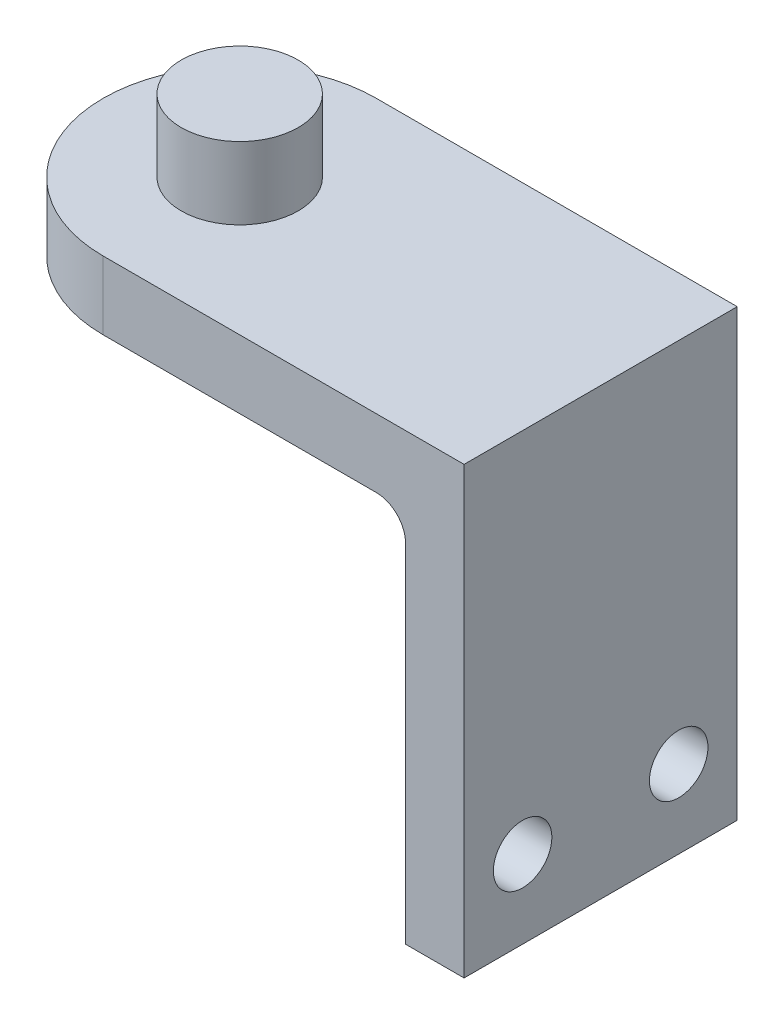
ISO-10303-21;
HEADER;
FILE_DESCRIPTION(('STEP AP214'),'2;1');
FILE_NAME('part.step','',(''),(''),'','','');
FILE_SCHEMA(('AUTOMOTIVE_DESIGN { 1 0 10303 214 1 1 1 1 }'));
ENDSEC;
DATA;
#1=APPLICATION_CONTEXT('core data for automotive mechanical design processes');
#2=APPLICATION_PROTOCOL_DEFINITION('international standard','automotive_design',2000,#1);
#3=PRODUCT_CONTEXT('',#1,'mechanical');
#4=PRODUCT('Part','Part','',(#3));
#5=PRODUCT_RELATED_PRODUCT_CATEGORY('part','',(#4));
#6=PRODUCT_DEFINITION_FORMATION('','',#4);
#7=PRODUCT_DEFINITION_CONTEXT('part definition',#1,'design');
#8=PRODUCT_DEFINITION('design','',#6,#7);
#9=PRODUCT_DEFINITION_SHAPE('','',#8);
#10=(LENGTH_UNIT() NAMED_UNIT(*) SI_UNIT(.MILLI.,.METRE.));
#11=(NAMED_UNIT(*) PLANE_ANGLE_UNIT() SI_UNIT($,.RADIAN.));
#12=(NAMED_UNIT(*) SI_UNIT($,.STERADIAN.) SOLID_ANGLE_UNIT());
#13=UNCERTAINTY_MEASURE_WITH_UNIT(LENGTH_MEASURE(1.E-05),#10,'distance_accuracy_value','');
#14=(GEOMETRIC_REPRESENTATION_CONTEXT(3) GLOBAL_UNCERTAINTY_ASSIGNED_CONTEXT((#13)) GLOBAL_UNIT_ASSIGNED_CONTEXT((#10,
#11,#12)) REPRESENTATION_CONTEXT('',''));
#15=CARTESIAN_POINT('',(0.,0.,0.));
#16=DIRECTION('',(0.,0.,1.));
#17=DIRECTION('',(1.,0.,0.));
#18=AXIS2_PLACEMENT_3D('',#15,#16,#17);
#19=CARTESIAN_POINT('',(21.,0.,7.));
#20=DIRECTION('',(0.,1.,0.));
#21=DIRECTION('',(0.,0.,1.));
#22=AXIS2_PLACEMENT_3D('',#19,#20,#21);
#23=PLANE('',#22);
#24=DIRECTION('',(1.,0.,0.));
#25=VECTOR('',#24,1.);
#26=CARTESIAN_POINT('',(21.,0.,-7.));
#27=LINE('',#26,#25);
#28=CARTESIAN_POINT('',(21.,0.,-7.));
#29=VERTEX_POINT('',#28);
#30=CARTESIAN_POINT('',(24.,0.,-7.));
#31=VERTEX_POINT('',#30);
#32=EDGE_CURVE('E213',#29,#31,#27,.T.);
#33=ORIENTED_EDGE('',*,*,#32,.T.);
#34=DIRECTION('',(0.,0.,-1.));
#35=VECTOR('',#34,1.);
#36=CARTESIAN_POINT('',(24.,0.,7.));
#37=LINE('',#36,#35);
#38=CARTESIAN_POINT('',(24.,0.,7.));
#39=VERTEX_POINT('',#38);
#40=EDGE_CURVE('E216',#39,#31,#37,.T.);
#41=ORIENTED_EDGE('',*,*,#40,.F.);
#42=DIRECTION('',(1.,0.,0.));
#43=VECTOR('',#42,1.);
#44=CARTESIAN_POINT('',(21.,0.,7.));
#45=LINE('',#44,#43);
#46=CARTESIAN_POINT('',(21.,0.,7.));
#47=VERTEX_POINT('',#46);
#48=EDGE_CURVE('E212',#47,#39,#45,.T.);
#49=ORIENTED_EDGE('',*,*,#48,.F.);
#50=DIRECTION('',(0.,0.,-1.));
#51=VECTOR('',#50,1.);
#52=CARTESIAN_POINT('',(21.,0.,7.));
#53=LINE('',#52,#51);
#54=EDGE_CURVE('E222',#47,#29,#53,.T.);
#55=ORIENTED_EDGE('',*,*,#54,.T.);
#56=EDGE_LOOP('',(#33,#41,#49,#55));
#57=FACE_BOUND('',#56,.T.);
#58=DIRECTION('',(0.,0.,1.));
#59=VECTOR('',#58,1.);
#60=CARTESIAN_POINT('',(21.9,0.,6.7));
#61=LINE('',#60,#59);
#62=CARTESIAN_POINT('',(21.9,0.,-6.7));
#63=VERTEX_POINT('',#62);
#64=CARTESIAN_POINT('',(21.9,0.,6.7));
#65=VERTEX_POINT('',#64);
#66=EDGE_CURVE('E537',#63,#65,#61,.T.);
#67=ORIENTED_EDGE('',*,*,#66,.T.);
#68=DIRECTION('',(1.,0.,0.));
#69=VECTOR('',#68,1.);
#70=CARTESIAN_POINT('',(21.9,0.,6.7));
#71=LINE('',#70,#69);
#72=CARTESIAN_POINT('',(23.1,0.,6.7));
#73=VERTEX_POINT('',#72);
#74=EDGE_CURVE('E171',#65,#73,#71,.T.);
#75=ORIENTED_EDGE('',*,*,#74,.T.);
#76=DIRECTION('',(0.,0.,-1.));
#77=VECTOR('',#76,1.);
#78=CARTESIAN_POINT('',(23.1,0.,6.7));
#79=LINE('',#78,#77);
#80=CARTESIAN_POINT('',(23.1,0.,-6.7));
#81=VERTEX_POINT('',#80);
#82=EDGE_CURVE('E532',#73,#81,#79,.T.);
#83=ORIENTED_EDGE('',*,*,#82,.T.);
#84=DIRECTION('',(-1.,0.,0.));
#85=VECTOR('',#84,1.);
#86=CARTESIAN_POINT('',(21.9,0.,-6.7));
#87=LINE('',#86,#85);
#88=EDGE_CURVE('E167',#81,#63,#87,.T.);
#89=ORIENTED_EDGE('',*,*,#88,.T.);
#90=EDGE_LOOP('',(#67,#75,#83,#89));
#91=FACE_BOUND('',#90,.T.);
#92=ADVANCED_FACE('F37',(#57,#91),#23,.F.);
#93=CARTESIAN_POINT('',(5.5,19.3,0.));
#94=DIRECTION('',(0.,1.,0.));
#95=DIRECTION('',(0.,0.,1.));
#96=AXIS2_PLACEMENT_3D('',#93,#94,#95);
#97=PLANE('',#96);
#98=DIRECTION('',(-1.,0.,0.));
#99=VECTOR('',#98,1.);
#100=CARTESIAN_POINT('',(24.,19.3,-7.));
#101=LINE('',#100,#99);
#102=CARTESIAN_POINT('',(19.5,19.3,-7.));
#103=VERTEX_POINT('',#102);
#104=CARTESIAN_POINT('',(5.5,19.3,-7.));
#105=VERTEX_POINT('',#104);
#106=EDGE_CURVE('E230',#103,#105,#101,.T.);
#107=ORIENTED_EDGE('',*,*,#106,.F.);
#108=DIRECTION('',(0.,0.,-1.));
#109=VECTOR('',#108,1.);
#110=CARTESIAN_POINT('',(19.5,19.3,7.));
#111=LINE('',#110,#109);
#112=CARTESIAN_POINT('',(19.5,19.3,-2.7));
#113=VERTEX_POINT('',#112);
#114=EDGE_CURVE('E257',#103,#113,#111,.F.);
#115=ORIENTED_EDGE('',*,*,#114,.T.);
#116=DIRECTION('',(-1.,0.,0.));
#117=VECTOR('',#116,1.);
#118=CARTESIAN_POINT('',(20.7,19.3,-2.7));
#119=LINE('',#118,#117);
#120=CARTESIAN_POINT('',(8.0298221281347,19.3,-2.7));
#121=VERTEX_POINT('',#120);
#122=EDGE_CURVE('E176',#113,#121,#119,.T.);
#123=ORIENTED_EDGE('',*,*,#122,.T.);
#124=CARTESIAN_POINT('',(5.5,19.3,0.));
#125=DIRECTION('',(0.,1.,0.));
#126=DIRECTION('',(0.,0.,1.));
#127=AXIS2_PLACEMENT_3D('',#124,#125,#126);
#128=CIRCLE('',#127,3.7);
#129=CARTESIAN_POINT('',(8.0298221281347,19.3,2.7));
#130=VERTEX_POINT('',#129);
#131=EDGE_CURVE('E197',#121,#130,#128,.T.);
#132=ORIENTED_EDGE('',*,*,#131,.T.);
#133=DIRECTION('',(1.,0.,0.));
#134=VECTOR('',#133,1.);
#135=CARTESIAN_POINT('',(5.5,19.3,2.7));
#136=LINE('',#135,#134);
#137=CARTESIAN_POINT('',(19.5,19.3,2.7));
#138=VERTEX_POINT('',#137);
#139=EDGE_CURVE('E172',#130,#138,#136,.T.);
#140=ORIENTED_EDGE('',*,*,#139,.T.);
#141=DIRECTION('',(0.,0.,-1.));
#142=VECTOR('',#141,1.);
#143=CARTESIAN_POINT('',(19.5,19.3,7.));
#144=LINE('',#143,#142);
#145=CARTESIAN_POINT('',(19.5,19.3,7.));
#146=VERTEX_POINT('',#145);
#147=EDGE_CURVE('E255',#138,#146,#144,.F.);
#148=ORIENTED_EDGE('',*,*,#147,.T.);
#149=DIRECTION('',(1.,0.,0.));
#150=VECTOR('',#149,1.);
#151=CARTESIAN_POINT('',(5.5,19.3,7.));
#152=LINE('',#151,#150);
#153=CARTESIAN_POINT('',(5.5,19.3,7.));
#154=VERTEX_POINT('',#153);
#155=EDGE_CURVE('E239',#154,#146,#152,.T.);
#156=ORIENTED_EDGE('',*,*,#155,.F.);
#157=CARTESIAN_POINT('',(5.5,19.3,0.));
#158=DIRECTION('',(0.,1.,0.));
#159=DIRECTION('',(0.,0.,1.));
#160=AXIS2_PLACEMENT_3D('',#157,#158,#159);
#161=CIRCLE('',#160,7.);
#162=EDGE_CURVE('E225',#105,#154,#161,.T.);
#163=ORIENTED_EDGE('',*,*,#162,.F.);
#164=EDGE_LOOP('',(#107,#115,#123,#132,#140,#148,#156,#163));
#165=FACE_BOUND('',#164,.T.);
#166=ADVANCED_FACE('F272',(#165),#97,.F.);
#167=CARTESIAN_POINT('',(5.5,20.9,0.));
#168=DIRECTION('',(0.,-1.,0.));
#169=DIRECTION('',(0.,0.,-1.));
#170=AXIS2_PLACEMENT_3D('',#167,#168,#169);
#171=CYLINDRICAL_SURFACE('',#170,3.7);
#172=CARTESIAN_POINT('',(5.5,20.9,0.));
#173=DIRECTION('',(0.,1.,0.));
#174=DIRECTION('',(0.,0.,1.));
#175=AXIS2_PLACEMENT_3D('',#172,#173,#174);
#176=CIRCLE('',#175,3.7);
#177=CARTESIAN_POINT('',(8.02982212813471,20.9,-2.7));
#178=VERTEX_POINT('',#177);
#179=CARTESIAN_POINT('',(8.0298221281347,20.9,2.7));
#180=VERTEX_POINT('',#179);
#181=EDGE_CURVE('E198',#178,#180,#176,.T.);
#182=ORIENTED_EDGE('',*,*,#181,.T.);
#183=DIRECTION('',(0.,-1.,0.));
#184=VECTOR('',#183,1.);
#185=CARTESIAN_POINT('',(8.02982212813471,20.9,2.7));
#186=LINE('',#185,#184);
#187=EDGE_CURVE('E194',#180,#130,#186,.T.);
#188=ORIENTED_EDGE('',*,*,#187,.T.);
#189=ORIENTED_EDGE('',*,*,#131,.F.);
#190=DIRECTION('',(0.,-1.,0.));
#191=VECTOR('',#190,1.);
#192=CARTESIAN_POINT('',(8.02982212813471,20.9,-2.7));
#193=LINE('',#192,#191);
#194=EDGE_CURVE('E191',#121,#178,#193,.F.);
#195=ORIENTED_EDGE('',*,*,#194,.T.);
#196=EDGE_LOOP('',(#182,#188,#189,#195));
#197=FACE_BOUND('',#196,.T.);
#198=ADVANCED_FACE('F312',(#197),#171,.F.);
#199=CARTESIAN_POINT('',(5.5,22.8,0.));
#200=DIRECTION('',(0.,-1.,0.));
#201=DIRECTION('',(0.,0.,-1.));
#202=AXIS2_PLACEMENT_3D('',#199,#200,#201);
#203=CYLINDRICAL_SURFACE('',#202,7.);
#204=ORIENTED_EDGE('',*,*,#162,.T.);
#205=DIRECTION('',(0.,-1.,0.));
#206=VECTOR('',#205,1.);
#207=CARTESIAN_POINT('',(5.5,22.8,7.));
#208=LINE('',#207,#206);
#209=CARTESIAN_POINT('',(5.5,22.8,7.));
#210=VERTEX_POINT('',#209);
#211=EDGE_CURVE('E249',#210,#154,#208,.T.);
#212=ORIENTED_EDGE('',*,*,#211,.F.);
#213=CARTESIAN_POINT('',(5.5,22.8,0.));
#214=DIRECTION('',(0.,1.,0.));
#215=DIRECTION('',(0.,0.,1.));
#216=AXIS2_PLACEMENT_3D('',#213,#214,#215);
#217=CIRCLE('',#216,7.);
#218=CARTESIAN_POINT('',(5.5,22.8,-7.));
#219=VERTEX_POINT('',#218);
#220=EDGE_CURVE('E226',#219,#210,#217,.T.);
#221=ORIENTED_EDGE('',*,*,#220,.F.);
#222=DIRECTION('',(0.,-1.,0.));
#223=VECTOR('',#222,1.);
#224=CARTESIAN_POINT('',(5.5,22.8,-7.));
#225=LINE('',#224,#223);
#226=EDGE_CURVE('E236',#219,#105,#225,.T.);
#227=ORIENTED_EDGE('',*,*,#226,.T.);
#228=EDGE_LOOP('',(#204,#212,#221,#227));
#229=FACE_BOUND('',#228,.T.);
#230=ADVANCED_FACE('F301',(#229),#203,.T.);
#231=CARTESIAN_POINT('',(5.5,22.8,7.));
#232=DIRECTION('',(0.,0.,-1.));
#233=DIRECTION('',(-1.,0.,0.));
#234=AXIS2_PLACEMENT_3D('',#231,#232,#233);
#235=PLANE('',#234);
#236=DIRECTION('',(0.,-1.,0.));
#237=VECTOR('',#236,1.);
#238=CARTESIAN_POINT('',(24.,22.8,7.));
#239=LINE('',#238,#237);
#240=CARTESIAN_POINT('',(24.,22.8,7.));
#241=VERTEX_POINT('',#240);
#242=EDGE_CURVE('E247',#241,#39,#239,.T.);
#243=ORIENTED_EDGE('',*,*,#242,.F.);
#244=DIRECTION('',(1.,0.,0.));
#245=VECTOR('',#244,1.);
#246=CARTESIAN_POINT('',(5.5,22.8,7.));
#247=LINE('',#246,#245);
#248=EDGE_CURVE('E229',#210,#241,#247,.T.);
#249=ORIENTED_EDGE('',*,*,#248,.F.);
#250=ORIENTED_EDGE('',*,*,#211,.T.);
#251=ORIENTED_EDGE('',*,*,#155,.T.);
#252=CARTESIAN_POINT('',(19.5,17.8,7.));
#253=DIRECTION('',(0.,0.,-1.));
#254=DIRECTION('',(-1.,0.,0.));
#255=AXIS2_PLACEMENT_3D('',#252,#253,#254);
#256=CIRCLE('',#255,1.5);
#257=CARTESIAN_POINT('',(21.,17.8,7.));
#258=VERTEX_POINT('',#257);
#259=EDGE_CURVE('E11',#146,#258,#256,.T.);
#260=ORIENTED_EDGE('',*,*,#259,.T.);
#261=DIRECTION('',(0.,-1.,0.));
#262=VECTOR('',#261,1.);
#263=CARTESIAN_POINT('',(21.,0.,7.));
#264=LINE('',#263,#262);
#265=EDGE_CURVE('E210',#258,#47,#264,.T.);
#266=ORIENTED_EDGE('',*,*,#265,.T.);
#267=ORIENTED_EDGE('',*,*,#48,.T.);
#268=EDGE_LOOP('',(#243,#249,#250,#251,#260,#266,#267));
#269=FACE_BOUND('',#268,.T.);
#270=ADVANCED_FACE('F280',(#269),#235,.F.);
#271=CARTESIAN_POINT('',(24.,22.8,7.));
#272=DIRECTION('',(-1.,0.,0.));
#273=DIRECTION('',(0.,0.,1.));
#274=AXIS2_PLACEMENT_3D('',#271,#272,#273);
#275=PLANE('',#274);
#276=CARTESIAN_POINT('',(24.,4.,4.));
#277=DIRECTION('',(1.,0.,0.));
#278=DIRECTION('',(0.,0.,-1.));
#279=AXIS2_PLACEMENT_3D('',#276,#277,#278);
#280=CIRCLE('',#279,1.5);
#281=CARTESIAN_POINT('',(24.,4.,2.5));
#282=VERTEX_POINT('',#281);
#283=EDGE_CURVE('E553',#282,#282,#280,.T.);
#284=ORIENTED_EDGE('',*,*,#283,.F.);
#285=EDGE_LOOP('',(#284));
#286=FACE_BOUND('',#285,.T.);
#287=CARTESIAN_POINT('',(24.,4.,-4.));
#288=DIRECTION('',(1.,0.,0.));
#289=DIRECTION('',(0.,0.,-1.));
#290=AXIS2_PLACEMENT_3D('',#287,#288,#289);
#291=CIRCLE('',#290,1.5);
#292=CARTESIAN_POINT('',(24.,4.,-5.5));
#293=VERTEX_POINT('',#292);
#294=EDGE_CURVE('E547',#293,#293,#291,.T.);
#295=ORIENTED_EDGE('',*,*,#294,.F.);
#296=EDGE_LOOP('',(#295));
#297=FACE_BOUND('',#296,.T.);
#298=ORIENTED_EDGE('',*,*,#242,.T.);
#299=ORIENTED_EDGE('',*,*,#40,.T.);
#300=DIRECTION('',(0.,-1.,0.));
#301=VECTOR('',#300,1.);
#302=CARTESIAN_POINT('',(24.,22.8,-7.));
#303=LINE('',#302,#301);
#304=CARTESIAN_POINT('',(24.,22.8,-7.));
#305=VERTEX_POINT('',#304);
#306=EDGE_CURVE('E245',#305,#31,#303,.T.);
#307=ORIENTED_EDGE('',*,*,#306,.F.);
#308=DIRECTION('',(0.,0.,-1.));
#309=VECTOR('',#308,1.);
#310=CARTESIAN_POINT('',(24.,22.8,7.));
#311=LINE('',#310,#309);
#312=EDGE_CURVE('E232',#241,#305,#311,.T.);
#313=ORIENTED_EDGE('',*,*,#312,.F.);
#314=EDGE_LOOP('',(#298,#299,#307,#313));
#315=FACE_BOUND('',#314,.T.);
#316=ADVANCED_FACE('F293',(#286,#297,#315),#275,.F.);
#317=CARTESIAN_POINT('',(24.,22.8,-7.));
#318=DIRECTION('',(0.,0.,1.));
#319=DIRECTION('',(1.,0.,0.));
#320=AXIS2_PLACEMENT_3D('',#317,#318,#319);
#321=PLANE('',#320);
#322=ORIENTED_EDGE('',*,*,#306,.T.);
#323=ORIENTED_EDGE('',*,*,#32,.F.);
#324=DIRECTION('',(0.,-1.,0.));
#325=VECTOR('',#324,1.);
#326=CARTESIAN_POINT('',(21.,0.,-7.));
#327=LINE('',#326,#325);
#328=CARTESIAN_POINT('',(21.,17.8,-7.));
#329=VERTEX_POINT('',#328);
#330=EDGE_CURVE('E207',#329,#29,#327,.T.);
#331=ORIENTED_EDGE('',*,*,#330,.F.);
#332=CARTESIAN_POINT('',(19.5,17.8,-7.));
#333=DIRECTION('',(0.,0.,1.));
#334=DIRECTION('',(1.,0.,0.));
#335=AXIS2_PLACEMENT_3D('',#332,#333,#334);
#336=CIRCLE('',#335,1.5);
#337=EDGE_CURVE('E259',#329,#103,#336,.T.);
#338=ORIENTED_EDGE('',*,*,#337,.T.);
#339=ORIENTED_EDGE('',*,*,#106,.T.);
#340=ORIENTED_EDGE('',*,*,#226,.F.);
#341=DIRECTION('',(-1.,0.,0.));
#342=VECTOR('',#341,1.);
#343=CARTESIAN_POINT('',(24.,22.8,-7.));
#344=LINE('',#343,#342);
#345=EDGE_CURVE('E234',#305,#219,#344,.T.);
#346=ORIENTED_EDGE('',*,*,#345,.F.);
#347=EDGE_LOOP('',(#322,#323,#331,#338,#339,#340,#346));
#348=FACE_BOUND('',#347,.T.);
#349=ADVANCED_FACE('F341',(#348),#321,.F.);
#350=CARTESIAN_POINT('',(5.5,22.8,0.));
#351=DIRECTION('',(0.,1.,0.));
#352=DIRECTION('',(0.,0.,1.));
#353=AXIS2_PLACEMENT_3D('',#350,#351,#352);
#354=PLANE('',#353);
#355=CARTESIAN_POINT('',(5.5,22.8,0.));
#356=DIRECTION('',(0.,1.,0.));
#357=DIRECTION('',(0.,0.,1.));
#358=AXIS2_PLACEMENT_3D('',#355,#356,#357);
#359=CIRCLE('',#358,3.);
#360=CARTESIAN_POINT('',(5.5,22.8,3.));
#361=VERTEX_POINT('',#360);
#362=EDGE_CURVE('E201',#361,#361,#359,.T.);
#363=ORIENTED_EDGE('',*,*,#362,.F.);
#364=EDGE_LOOP('',(#363));
#365=FACE_BOUND('',#364,.T.);
#366=ORIENTED_EDGE('',*,*,#345,.T.);
#367=ORIENTED_EDGE('',*,*,#220,.T.);
#368=ORIENTED_EDGE('',*,*,#248,.T.);
#369=ORIENTED_EDGE('',*,*,#312,.T.);
#370=EDGE_LOOP('',(#366,#367,#368,#369));
#371=FACE_BOUND('',#370,.T.);
#372=ADVANCED_FACE('F296',(#365,#371),#354,.T.);
#373=CARTESIAN_POINT('',(21.,0.,7.));
#374=DIRECTION('',(1.,0.,0.));
#375=DIRECTION('',(0.,0.,-1.));
#376=AXIS2_PLACEMENT_3D('',#373,#374,#375);
#377=PLANE('',#376);
#378=CARTESIAN_POINT('',(21.,4.,4.));
#379=DIRECTION('',(1.,0.,0.));
#380=DIRECTION('',(0.,0.,-1.));
#381=AXIS2_PLACEMENT_3D('',#378,#379,#380);
#382=CIRCLE('',#381,1.5);
#383=CARTESIAN_POINT('',(21.,4.,2.5));
#384=VERTEX_POINT('',#383);
#385=EDGE_CURVE('E539',#384,#384,#382,.T.);
#386=ORIENTED_EDGE('',*,*,#385,.T.);
#387=EDGE_LOOP('',(#386));
#388=FACE_BOUND('',#387,.T.);
#389=CARTESIAN_POINT('',(21.,4.,-4.));
#390=DIRECTION('',(1.,0.,0.));
#391=DIRECTION('',(0.,0.,-1.));
#392=AXIS2_PLACEMENT_3D('',#389,#390,#391);
#393=CIRCLE('',#392,1.5);
#394=CARTESIAN_POINT('',(21.,4.,-5.5));
#395=VERTEX_POINT('',#394);
#396=EDGE_CURVE('E550',#395,#395,#393,.T.);
#397=ORIENTED_EDGE('',*,*,#396,.T.);
#398=EDGE_LOOP('',(#397));
#399=FACE_BOUND('',#398,.T.);
#400=ORIENTED_EDGE('',*,*,#265,.F.);
#401=DIRECTION('',(0.,0.,-1.));
#402=VECTOR('',#401,1.);
#403=CARTESIAN_POINT('',(21.,17.8,-7.));
#404=LINE('',#403,#402);
#405=EDGE_CURVE('E252',#258,#329,#404,.T.);
#406=ORIENTED_EDGE('',*,*,#405,.T.);
#407=ORIENTED_EDGE('',*,*,#330,.T.);
#408=ORIENTED_EDGE('',*,*,#54,.F.);
#409=EDGE_LOOP('',(#400,#406,#407,#408));
#410=FACE_BOUND('',#409,.T.);
#411=ADVANCED_FACE('F284',(#388,#399,#410),#377,.F.);
#412=CARTESIAN_POINT('',(5.5,26.5,0.));
#413=DIRECTION('',(0.,-1.,0.));
#414=DIRECTION('',(0.,0.,-1.));
#415=AXIS2_PLACEMENT_3D('',#412,#413,#414);
#416=CYLINDRICAL_SURFACE('',#415,3.);
#417=CARTESIAN_POINT('',(5.5,26.5,0.));
#418=DIRECTION('',(0.,1.,0.));
#419=DIRECTION('',(0.,0.,1.));
#420=AXIS2_PLACEMENT_3D('',#417,#418,#419);
#421=CIRCLE('',#420,3.);
#422=CARTESIAN_POINT('',(5.5,26.5,3.));
#423=VERTEX_POINT('',#422);
#424=EDGE_CURVE('E204',#423,#423,#421,.T.);
#425=ORIENTED_EDGE('',*,*,#424,.F.);
#426=EDGE_LOOP('',(#425));
#427=FACE_BOUND('',#426,.T.);
#428=ORIENTED_EDGE('',*,*,#362,.T.);
#429=EDGE_LOOP('',(#428));
#430=FACE_BOUND('',#429,.T.);
#431=ADVANCED_FACE('F325',(#427,#430),#416,.T.);
#432=CARTESIAN_POINT('',(5.5,26.5,0.));
#433=DIRECTION('',(0.,1.,0.));
#434=DIRECTION('',(0.,0.,1.));
#435=AXIS2_PLACEMENT_3D('',#432,#433,#434);
#436=PLANE('',#435);
#437=ORIENTED_EDGE('',*,*,#424,.T.);
#438=EDGE_LOOP('',(#437));
#439=FACE_BOUND('',#438,.T.);
#440=ADVANCED_FACE('F318',(#439),#436,.T.);
#441=CARTESIAN_POINT('',(5.5,20.9,0.));
#442=DIRECTION('',(0.,1.,0.));
#443=DIRECTION('',(0.,0.,1.));
#444=AXIS2_PLACEMENT_3D('',#441,#442,#443);
#445=PLANE('',#444);
#446=ORIENTED_EDGE('',*,*,#181,.F.);
#447=DIRECTION('',(-1.,0.,0.));
#448=VECTOR('',#447,1.);
#449=CARTESIAN_POINT('',(20.7,20.9,-2.7));
#450=LINE('',#449,#448);
#451=CARTESIAN_POINT('',(20.7,20.9,-2.7));
#452=VERTEX_POINT('',#451);
#453=EDGE_CURVE('E186',#452,#178,#450,.T.);
#454=ORIENTED_EDGE('',*,*,#453,.F.);
#455=DIRECTION('',(0.,0.,-1.));
#456=VECTOR('',#455,1.);
#457=CARTESIAN_POINT('',(20.7,20.9,2.7));
#458=LINE('',#457,#456);
#459=CARTESIAN_POINT('',(20.7,20.9,2.7));
#460=VERTEX_POINT('',#459);
#461=EDGE_CURVE('E184',#460,#452,#458,.T.);
#462=ORIENTED_EDGE('',*,*,#461,.F.);
#463=DIRECTION('',(1.,0.,0.));
#464=VECTOR('',#463,1.);
#465=CARTESIAN_POINT('',(5.5,20.9,2.7));
#466=LINE('',#465,#464);
#467=EDGE_CURVE('E182',#180,#460,#466,.T.);
#468=ORIENTED_EDGE('',*,*,#467,.F.);
#469=EDGE_LOOP('',(#446,#454,#462,#468));
#470=FACE_BOUND('',#469,.T.);
#471=ADVANCED_FACE('F316',(#470),#445,.F.);
#472=CARTESIAN_POINT('',(5.5,20.9,2.7));
#473=DIRECTION('',(0.,0.,-1.));
#474=DIRECTION('',(-1.,0.,0.));
#475=AXIS2_PLACEMENT_3D('',#472,#473,#474);
#476=PLANE('',#475);
#477=ORIENTED_EDGE('',*,*,#467,.T.);
#478=DIRECTION('',(0.,-1.,0.));
#479=VECTOR('',#478,1.);
#480=CARTESIAN_POINT('',(20.7,20.9,2.7));
#481=LINE('',#480,#479);
#482=CARTESIAN_POINT('',(20.7,18.7,2.7));
#483=VERTEX_POINT('',#482);
#484=EDGE_CURVE('E52',#460,#483,#481,.T.);
#485=ORIENTED_EDGE('',*,*,#484,.T.);
#486=CARTESIAN_POINT('',(19.5,17.8,2.7));
#487=DIRECTION('',(0.,0.,-1.));
#488=DIRECTION('',(-1.,0.,0.));
#489=AXIS2_PLACEMENT_3D('',#486,#487,#488);
#490=CIRCLE('',#489,1.5);
#491=EDGE_CURVE('E45',#483,#138,#490,.F.);
#492=ORIENTED_EDGE('',*,*,#491,.T.);
#493=ORIENTED_EDGE('',*,*,#139,.F.);
#494=ORIENTED_EDGE('',*,*,#187,.F.);
#495=EDGE_LOOP('',(#477,#485,#492,#493,#494));
#496=FACE_BOUND('',#495,.T.);
#497=ADVANCED_FACE('F265',(#496),#476,.T.);
#498=CARTESIAN_POINT('',(20.7,20.9,2.7));
#499=DIRECTION('',(-1.,0.,0.));
#500=DIRECTION('',(0.,0.,1.));
#501=AXIS2_PLACEMENT_3D('',#498,#499,#500);
#502=PLANE('',#501);
#503=DIRECTION('',(0.,-1.,0.));
#504=VECTOR('',#503,1.);
#505=CARTESIAN_POINT('',(20.7,20.9,-2.7));
#506=LINE('',#505,#504);
#507=CARTESIAN_POINT('',(20.7,18.7,-2.7));
#508=VERTEX_POINT('',#507);
#509=EDGE_CURVE('E59',#452,#508,#506,.T.);
#510=ORIENTED_EDGE('',*,*,#509,.T.);
#511=DIRECTION('',(0.,0.,1.));
#512=VECTOR('',#511,1.);
#513=CARTESIAN_POINT('',(20.7,18.7,-2.7));
#514=LINE('',#513,#512);
#515=EDGE_CURVE('E263',#508,#483,#514,.T.);
#516=ORIENTED_EDGE('',*,*,#515,.T.);
#517=ORIENTED_EDGE('',*,*,#484,.F.);
#518=ORIENTED_EDGE('',*,*,#461,.T.);
#519=EDGE_LOOP('',(#510,#516,#517,#518));
#520=FACE_BOUND('',#519,.T.);
#521=ADVANCED_FACE('F315',(#520),#502,.T.);
#522=CARTESIAN_POINT('',(20.7,20.9,-2.7));
#523=DIRECTION('',(0.,0.,1.));
#524=DIRECTION('',(1.,0.,0.));
#525=AXIS2_PLACEMENT_3D('',#522,#523,#524);
#526=PLANE('',#525);
#527=ORIENTED_EDGE('',*,*,#122,.F.);
#528=CARTESIAN_POINT('',(19.5,17.8,-2.7));
#529=DIRECTION('',(0.,0.,1.));
#530=DIRECTION('',(1.,0.,0.));
#531=AXIS2_PLACEMENT_3D('',#528,#529,#530);
#532=CIRCLE('',#531,1.5);
#533=EDGE_CURVE('E261',#113,#508,#532,.F.);
#534=ORIENTED_EDGE('',*,*,#533,.T.);
#535=ORIENTED_EDGE('',*,*,#509,.F.);
#536=ORIENTED_EDGE('',*,*,#453,.T.);
#537=ORIENTED_EDGE('',*,*,#194,.F.);
#538=EDGE_LOOP('',(#527,#534,#535,#536,#537));
#539=FACE_BOUND('',#538,.T.);
#540=ADVANCED_FACE('F307',(#539),#526,.T.);
#541=CARTESIAN_POINT('',(21.9,2.2,6.7));
#542=DIRECTION('',(1.,0.,0.));
#543=DIRECTION('',(0.,0.,-1.));
#544=AXIS2_PLACEMENT_3D('',#541,#542,#543);
#545=PLANE('',#544);
#546=ORIENTED_EDGE('',*,*,#66,.F.);
#547=DIRECTION('',(0.,-1.,0.));
#548=VECTOR('',#547,1.);
#549=CARTESIAN_POINT('',(21.9,2.2,-6.7));
#550=LINE('',#549,#548);
#551=CARTESIAN_POINT('',(21.9,2.2,-6.7));
#552=VERTEX_POINT('',#551);
#553=EDGE_CURVE('E166',#552,#63,#550,.T.);
#554=ORIENTED_EDGE('',*,*,#553,.F.);
#555=DIRECTION('',(0.,0.,1.));
#556=VECTOR('',#555,1.);
#557=CARTESIAN_POINT('',(21.9,2.2,6.7));
#558=LINE('',#557,#556);
#559=CARTESIAN_POINT('',(21.9,2.2,6.7));
#560=VERTEX_POINT('',#559);
#561=EDGE_CURVE('E153',#552,#560,#558,.T.);
#562=ORIENTED_EDGE('',*,*,#561,.T.);
#563=DIRECTION('',(0.,-1.,0.));
#564=VECTOR('',#563,1.);
#565=CARTESIAN_POINT('',(21.9,2.2,6.7));
#566=LINE('',#565,#564);
#567=EDGE_CURVE('E163',#560,#65,#566,.T.);
#568=ORIENTED_EDGE('',*,*,#567,.T.);
#569=EDGE_LOOP('',(#546,#554,#562,#568));
#570=FACE_BOUND('',#569,.T.);
#571=ADVANCED_FACE('F162',(#570),#545,.T.);
#572=CARTESIAN_POINT('',(21.9,2.2,6.7));
#573=DIRECTION('',(0.,0.,-1.));
#574=DIRECTION('',(-1.,0.,0.));
#575=AXIS2_PLACEMENT_3D('',#572,#573,#574);
#576=PLANE('',#575);
#577=ORIENTED_EDGE('',*,*,#74,.F.);
#578=ORIENTED_EDGE('',*,*,#567,.F.);
#579=DIRECTION('',(1.,0.,0.));
#580=VECTOR('',#579,1.);
#581=CARTESIAN_POINT('',(21.9,2.2,6.7));
#582=LINE('',#581,#580);
#583=CARTESIAN_POINT('',(23.1,2.2,6.7));
#584=VERTEX_POINT('',#583);
#585=EDGE_CURVE('E149',#560,#584,#582,.T.);
#586=ORIENTED_EDGE('',*,*,#585,.T.);
#587=DIRECTION('',(0.,-1.,0.));
#588=VECTOR('',#587,1.);
#589=CARTESIAN_POINT('',(23.1,2.2,6.7));
#590=LINE('',#589,#588);
#591=EDGE_CURVE('E173',#584,#73,#590,.T.);
#592=ORIENTED_EDGE('',*,*,#591,.T.);
#593=EDGE_LOOP('',(#577,#578,#586,#592));
#594=FACE_BOUND('',#593,.T.);
#595=ADVANCED_FACE('F169',(#594),#576,.T.);
#596=CARTESIAN_POINT('',(23.1,2.2,6.7));
#597=DIRECTION('',(-1.,0.,0.));
#598=DIRECTION('',(0.,0.,1.));
#599=AXIS2_PLACEMENT_3D('',#596,#597,#598);
#600=PLANE('',#599);
#601=ORIENTED_EDGE('',*,*,#82,.F.);
#602=ORIENTED_EDGE('',*,*,#591,.F.);
#603=DIRECTION('',(0.,0.,-1.));
#604=VECTOR('',#603,1.);
#605=CARTESIAN_POINT('',(23.1,2.2,6.7));
#606=LINE('',#605,#604);
#607=CARTESIAN_POINT('',(23.1,2.2,-6.7));
#608=VERTEX_POINT('',#607);
#609=EDGE_CURVE('E154',#584,#608,#606,.T.);
#610=ORIENTED_EDGE('',*,*,#609,.T.);
#611=DIRECTION('',(0.,-1.,0.));
#612=VECTOR('',#611,1.);
#613=CARTESIAN_POINT('',(23.1,2.2,-6.7));
#614=LINE('',#613,#612);
#615=EDGE_CURVE('E178',#608,#81,#614,.T.);
#616=ORIENTED_EDGE('',*,*,#615,.T.);
#617=EDGE_LOOP('',(#601,#602,#610,#616));
#618=FACE_BOUND('',#617,.T.);
#619=ADVANCED_FACE('F449',(#618),#600,.T.);
#620=CARTESIAN_POINT('',(21.9,2.2,-6.7));
#621=DIRECTION('',(0.,0.,1.));
#622=DIRECTION('',(1.,0.,0.));
#623=AXIS2_PLACEMENT_3D('',#620,#621,#622);
#624=PLANE('',#623);
#625=ORIENTED_EDGE('',*,*,#88,.F.);
#626=ORIENTED_EDGE('',*,*,#615,.F.);
#627=DIRECTION('',(-1.,0.,0.));
#628=VECTOR('',#627,1.);
#629=CARTESIAN_POINT('',(21.9,2.2,-6.7));
#630=LINE('',#629,#628);
#631=EDGE_CURVE('E544',#608,#552,#630,.T.);
#632=ORIENTED_EDGE('',*,*,#631,.T.);
#633=ORIENTED_EDGE('',*,*,#553,.T.);
#634=EDGE_LOOP('',(#625,#626,#632,#633));
#635=FACE_BOUND('',#634,.T.);
#636=ADVANCED_FACE('F442',(#635),#624,.T.);
#637=CARTESIAN_POINT('',(0.,2.2,0.));
#638=DIRECTION('',(0.,-1.,0.));
#639=DIRECTION('',(0.,0.,-1.));
#640=AXIS2_PLACEMENT_3D('',#637,#638,#639);
#641=PLANE('',#640);
#642=ORIENTED_EDGE('',*,*,#561,.F.);
#643=ORIENTED_EDGE('',*,*,#631,.F.);
#644=ORIENTED_EDGE('',*,*,#609,.F.);
#645=ORIENTED_EDGE('',*,*,#585,.F.);
#646=EDGE_LOOP('',(#642,#643,#644,#645));
#647=FACE_BOUND('',#646,.T.);
#648=ADVANCED_FACE('F151',(#647),#641,.T.);
#649=CARTESIAN_POINT('',(21.,4.,-4.));
#650=DIRECTION('',(1.,0.,0.));
#651=DIRECTION('',(0.,0.,-1.));
#652=AXIS2_PLACEMENT_3D('',#649,#650,#651);
#653=CYLINDRICAL_SURFACE('',#652,1.5);
#654=ORIENTED_EDGE('',*,*,#396,.F.);
#655=EDGE_LOOP('',(#654));
#656=FACE_BOUND('',#655,.T.);
#657=ORIENTED_EDGE('',*,*,#294,.T.);
#658=EDGE_LOOP('',(#657));
#659=FACE_BOUND('',#658,.T.);
#660=ADVANCED_FACE('F429',(#656,#659),#653,.F.);
#661=CARTESIAN_POINT('',(21.,4.,4.));
#662=DIRECTION('',(1.,0.,0.));
#663=DIRECTION('',(0.,0.,-1.));
#664=AXIS2_PLACEMENT_3D('',#661,#662,#663);
#665=CYLINDRICAL_SURFACE('',#664,1.5);
#666=ORIENTED_EDGE('',*,*,#385,.F.);
#667=EDGE_LOOP('',(#666));
#668=FACE_BOUND('',#667,.T.);
#669=ORIENTED_EDGE('',*,*,#283,.T.);
#670=EDGE_LOOP('',(#669));
#671=FACE_BOUND('',#670,.T.);
#672=ADVANCED_FACE('F368',(#668,#671),#665,.F.);
#673=CARTESIAN_POINT('',(19.5,17.8,7.));
#674=DIRECTION('',(0.,0.,1.));
#675=DIRECTION('',(1.,0.,0.));
#676=AXIS2_PLACEMENT_3D('',#673,#674,#675);
#677=CYLINDRICAL_SURFACE('',#676,1.5);
#678=ORIENTED_EDGE('',*,*,#533,.F.);
#679=ORIENTED_EDGE('',*,*,#114,.F.);
#680=ORIENTED_EDGE('',*,*,#337,.F.);
#681=ORIENTED_EDGE('',*,*,#405,.F.);
#682=ORIENTED_EDGE('',*,*,#259,.F.);
#683=ORIENTED_EDGE('',*,*,#147,.F.);
#684=ORIENTED_EDGE('',*,*,#491,.F.);
#685=ORIENTED_EDGE('',*,*,#515,.F.);
#686=EDGE_LOOP('',(#678,#679,#680,#681,#682,#683,#684,#685));
#687=FACE_BOUND('',#686,.T.);
#688=ADVANCED_FACE('F39',(#687),#677,.F.);
#689=CLOSED_SHELL('',(#92,#166,#198,#230,#270,#316,#349,#372,#411,#431,#440,#471,#497,#521,#540,
#571,#595,#619,#636,#648,#660,#672,#688));
#690=MANIFOLD_SOLID_BREP('B2',#689);
#691=ADVANCED_BREP_SHAPE_REPRESENTATION('',(#18,#690),#14);
#692=SHAPE_DEFINITION_REPRESENTATION(#9,#691);
ENDSEC;
END-ISO-10303-21;
